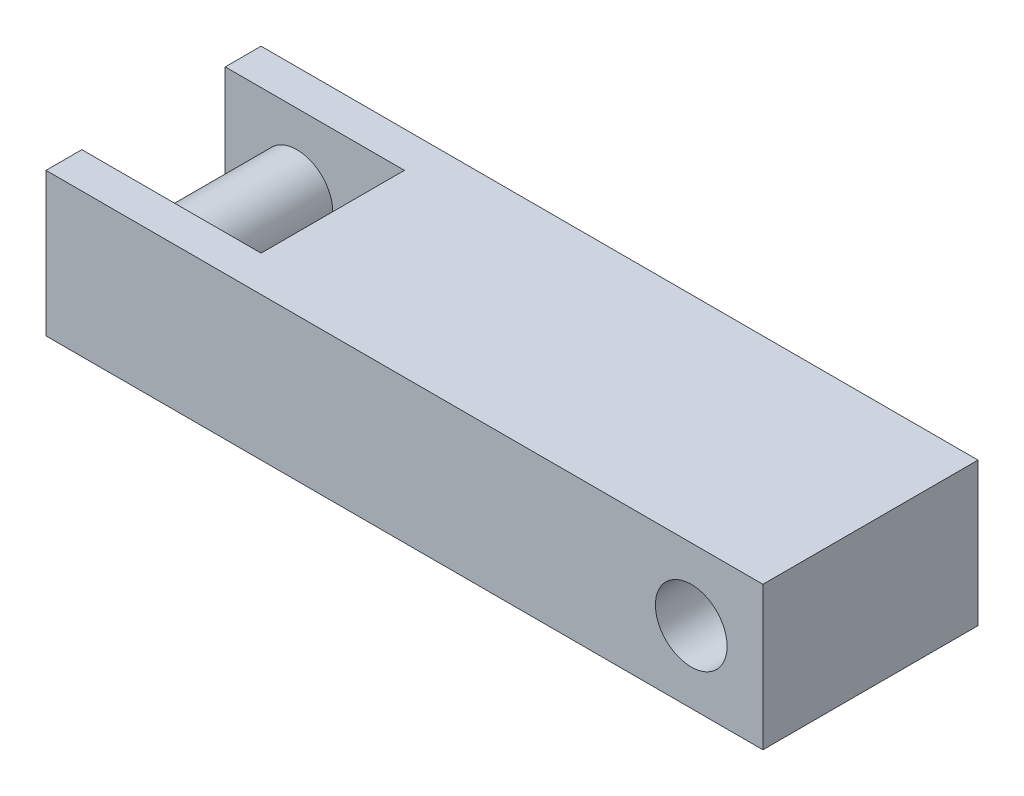
ISO-10303-21;
HEADER;
FILE_DESCRIPTION(('STEP AP214'),'2;1');
FILE_NAME('part.step','',(''),(''),'','','');
FILE_SCHEMA(('AUTOMOTIVE_DESIGN { 1 0 10303 214 1 1 1 1 }'));
ENDSEC;
DATA;
#1=APPLICATION_CONTEXT('core data for automotive mechanical design processes');
#2=APPLICATION_PROTOCOL_DEFINITION('international standard','automotive_design',2000,#1);
#3=PRODUCT_CONTEXT('',#1,'mechanical');
#4=PRODUCT('Part','Part','',(#3));
#5=PRODUCT_RELATED_PRODUCT_CATEGORY('part','',(#4));
#6=PRODUCT_DEFINITION_FORMATION('','',#4);
#7=PRODUCT_DEFINITION_CONTEXT('part definition',#1,'design');
#8=PRODUCT_DEFINITION('design','',#6,#7);
#9=PRODUCT_DEFINITION_SHAPE('','',#8);
#10=(LENGTH_UNIT() NAMED_UNIT(*) SI_UNIT(.MILLI.,.METRE.));
#11=(NAMED_UNIT(*) PLANE_ANGLE_UNIT() SI_UNIT($,.RADIAN.));
#12=(NAMED_UNIT(*) SI_UNIT($,.STERADIAN.) SOLID_ANGLE_UNIT());
#13=UNCERTAINTY_MEASURE_WITH_UNIT(LENGTH_MEASURE(1.E-05),#10,'distance_accuracy_value','');
#14=(GEOMETRIC_REPRESENTATION_CONTEXT(3) GLOBAL_UNCERTAINTY_ASSIGNED_CONTEXT((#13)) GLOBAL_UNIT_ASSIGNED_CONTEXT((#10,
#11,#12)) REPRESENTATION_CONTEXT('',''));
#15=CARTESIAN_POINT('',(0.,0.,0.));
#16=DIRECTION('',(0.,0.,1.));
#17=DIRECTION('',(1.,0.,0.));
#18=AXIS2_PLACEMENT_3D('',#15,#16,#17);
#19=CARTESIAN_POINT('',(0.,0.,30.));
#20=DIRECTION('',(1.,0.,0.));
#21=DIRECTION('',(0.,0.,-1.));
#22=AXIS2_PLACEMENT_3D('',#19,#20,#21);
#23=PLANE('',#22);
#24=DIRECTION('',(0.,0.,-1.));
#25=VECTOR('',#24,1.);
#26=CARTESIAN_POINT('',(0.,0.,30.));
#27=LINE('',#26,#25);
#28=CARTESIAN_POINT('',(0.,0.,5.));
#29=VERTEX_POINT('',#28);
#30=CARTESIAN_POINT('',(0.,0.,0.));
#31=VERTEX_POINT('',#30);
#32=EDGE_CURVE('E46',#29,#31,#27,.T.);
#33=ORIENTED_EDGE('',*,*,#32,.F.);
#34=DIRECTION('',(0.,-1.,0.));
#35=VECTOR('',#34,1.);
#36=CARTESIAN_POINT('',(0.,20.,5.));
#37=LINE('',#36,#35);
#38=CARTESIAN_POINT('',(0.,20.,5.));
#39=VERTEX_POINT('',#38);
#40=EDGE_CURVE('E117',#39,#29,#37,.T.);
#41=ORIENTED_EDGE('',*,*,#40,.F.);
#42=DIRECTION('',(0.,0.,-1.));
#43=VECTOR('',#42,1.);
#44=CARTESIAN_POINT('',(0.,20.,30.));
#45=LINE('',#44,#43);
#46=CARTESIAN_POINT('',(0.,20.,0.));
#47=VERTEX_POINT('',#46);
#48=EDGE_CURVE('E84',#39,#47,#45,.T.);
#49=ORIENTED_EDGE('',*,*,#48,.T.);
#50=DIRECTION('',(0.,-1.,0.));
#51=VECTOR('',#50,1.);
#52=CARTESIAN_POINT('',(0.,0.,0.));
#53=LINE('',#52,#51);
#54=EDGE_CURVE('E149',#47,#31,#53,.T.);
#55=ORIENTED_EDGE('',*,*,#54,.T.);
#56=EDGE_LOOP('',(#33,#41,#49,#55));
#57=FACE_BOUND('',#56,.T.);
#58=ADVANCED_FACE('F37',(#57),#23,.F.);
#59=CARTESIAN_POINT('',(0.,0.,30.));
#60=DIRECTION('',(0.,0.,-1.));
#61=DIRECTION('',(-1.,0.,0.));
#62=AXIS2_PLACEMENT_3D('',#59,#60,#61);
#63=PLANE('',#62);
#64=DIRECTION('',(0.,-1.,0.));
#65=VECTOR('',#64,1.);
#66=CARTESIAN_POINT('',(0.,0.,30.));
#67=LINE('',#66,#65);
#68=CARTESIAN_POINT('',(0.,20.,30.));
#69=VERTEX_POINT('',#68);
#70=CARTESIAN_POINT('',(0.,0.,30.));
#71=VERTEX_POINT('',#70);
#72=EDGE_CURVE('E152',#69,#71,#67,.T.);
#73=ORIENTED_EDGE('',*,*,#72,.T.);
#74=DIRECTION('',(1.,0.,0.));
#75=VECTOR('',#74,1.);
#76=CARTESIAN_POINT('',(0.,0.,30.));
#77=LINE('',#76,#75);
#78=CARTESIAN_POINT('',(100.,0.,30.));
#79=VERTEX_POINT('',#78);
#80=EDGE_CURVE('E91',#71,#79,#77,.T.);
#81=ORIENTED_EDGE('',*,*,#80,.T.);
#82=DIRECTION('',(0.,1.,0.));
#83=VECTOR('',#82,1.);
#84=CARTESIAN_POINT('',(100.,0.,30.));
#85=LINE('',#84,#83);
#86=CARTESIAN_POINT('',(100.,20.,30.));
#87=VERTEX_POINT('',#86);
#88=EDGE_CURVE('E156',#79,#87,#85,.T.);
#89=ORIENTED_EDGE('',*,*,#88,.T.);
#90=DIRECTION('',(-1.,0.,0.));
#91=VECTOR('',#90,1.);
#92=CARTESIAN_POINT('',(0.,20.,30.));
#93=LINE('',#92,#91);
#94=EDGE_CURVE('E62',#87,#69,#93,.T.);
#95=ORIENTED_EDGE('',*,*,#94,.T.);
#96=EDGE_LOOP('',(#73,#81,#89,#95));
#97=FACE_BOUND('',#96,.T.);
#98=CARTESIAN_POINT('',(90.,10.,30.));
#99=DIRECTION('',(0.,0.,1.));
#100=DIRECTION('',(1.,0.,0.));
#101=AXIS2_PLACEMENT_3D('',#98,#99,#100);
#102=CIRCLE('',#101,5.);
#103=CARTESIAN_POINT('',(95.,10.,30.));
#104=VERTEX_POINT('',#103);
#105=EDGE_CURVE('E146',#104,#104,#102,.T.);
#106=ORIENTED_EDGE('',*,*,#105,.F.);
#107=EDGE_LOOP('',(#106));
#108=FACE_BOUND('',#107,.T.);
#109=ADVANCED_FACE('F183',(#97,#108),#63,.F.);
#110=CARTESIAN_POINT('',(0.,0.,0.));
#111=DIRECTION('',(0.,0.,-1.));
#112=DIRECTION('',(-1.,0.,0.));
#113=AXIS2_PLACEMENT_3D('',#110,#111,#112);
#114=PLANE('',#113);
#115=ORIENTED_EDGE('',*,*,#54,.F.);
#116=DIRECTION('',(-1.,0.,0.));
#117=VECTOR('',#116,1.);
#118=CARTESIAN_POINT('',(0.,20.,0.));
#119=LINE('',#118,#117);
#120=CARTESIAN_POINT('',(100.,20.,0.));
#121=VERTEX_POINT('',#120);
#122=EDGE_CURVE('E154',#121,#47,#119,.T.);
#123=ORIENTED_EDGE('',*,*,#122,.F.);
#124=DIRECTION('',(0.,1.,0.));
#125=VECTOR('',#124,1.);
#126=CARTESIAN_POINT('',(100.,0.,0.));
#127=LINE('',#126,#125);
#128=CARTESIAN_POINT('',(100.,0.,0.));
#129=VERTEX_POINT('',#128);
#130=EDGE_CURVE('E162',#129,#121,#127,.T.);
#131=ORIENTED_EDGE('',*,*,#130,.F.);
#132=DIRECTION('',(1.,0.,0.));
#133=VECTOR('',#132,1.);
#134=CARTESIAN_POINT('',(0.,0.,0.));
#135=LINE('',#134,#133);
#136=EDGE_CURVE('E160',#31,#129,#135,.T.);
#137=ORIENTED_EDGE('',*,*,#136,.F.);
#138=EDGE_LOOP('',(#115,#123,#131,#137));
#139=FACE_BOUND('',#138,.T.);
#140=CARTESIAN_POINT('',(90.,10.,0.));
#141=DIRECTION('',(0.,0.,1.));
#142=DIRECTION('',(1.,0.,0.));
#143=AXIS2_PLACEMENT_3D('',#140,#141,#142);
#144=CIRCLE('',#143,5.);
#145=CARTESIAN_POINT('',(95.,10.,0.));
#146=VERTEX_POINT('',#145);
#147=EDGE_CURVE('E141',#146,#146,#144,.T.);
#148=ORIENTED_EDGE('',*,*,#147,.T.);
#149=EDGE_LOOP('',(#148));
#150=FACE_BOUND('',#149,.T.);
#151=ADVANCED_FACE('F179',(#139,#150),#114,.T.);
#152=CARTESIAN_POINT('',(0.,20.,25.));
#153=VERTEX_POINT('',#152);
#154=EDGE_CURVE('E165',#69,#153,#45,.T.);
#155=ORIENTED_EDGE('',*,*,#154,.T.);
#156=DIRECTION('',(0.,1.,0.));
#157=VECTOR('',#156,1.);
#158=CARTESIAN_POINT('',(0.,20.,25.));
#159=LINE('',#158,#157);
#160=CARTESIAN_POINT('',(0.,0.,25.));
#161=VERTEX_POINT('',#160);
#162=EDGE_CURVE('E128',#161,#153,#159,.T.);
#163=ORIENTED_EDGE('',*,*,#162,.F.);
#164=EDGE_CURVE('E11',#71,#161,#27,.T.);
#165=ORIENTED_EDGE('',*,*,#164,.F.);
#166=ORIENTED_EDGE('',*,*,#72,.F.);
#167=EDGE_LOOP('',(#155,#163,#165,#166));
#168=FACE_BOUND('',#167,.T.);
#169=ADVANCED_FACE('F39',(#168),#23,.F.);
#170=CARTESIAN_POINT('',(0.,0.,30.));
#171=DIRECTION('',(0.,1.,0.));
#172=DIRECTION('',(0.,0.,1.));
#173=AXIS2_PLACEMENT_3D('',#170,#171,#172);
#174=PLANE('',#173);
#175=DIRECTION('',(0.,0.,1.));
#176=VECTOR('',#175,1.);
#177=CARTESIAN_POINT('',(25.,0.,5.));
#178=LINE('',#177,#176);
#179=CARTESIAN_POINT('',(25.,0.,5.));
#180=VERTEX_POINT('',#179);
#181=CARTESIAN_POINT('',(25.,0.,25.));
#182=VERTEX_POINT('',#181);
#183=EDGE_CURVE('E124',#180,#182,#178,.T.);
#184=ORIENTED_EDGE('',*,*,#183,.F.);
#185=DIRECTION('',(-1.,0.,0.));
#186=VECTOR('',#185,1.);
#187=CARTESIAN_POINT('',(25.,0.,5.));
#188=LINE('',#187,#186);
#189=EDGE_CURVE('E113',#180,#29,#188,.T.);
#190=ORIENTED_EDGE('',*,*,#189,.T.);
#191=ORIENTED_EDGE('',*,*,#32,.T.);
#192=ORIENTED_EDGE('',*,*,#136,.T.);
#193=DIRECTION('',(0.,0.,-1.));
#194=VECTOR('',#193,1.);
#195=CARTESIAN_POINT('',(100.,0.,30.));
#196=LINE('',#195,#194);
#197=EDGE_CURVE('E171',#79,#129,#196,.T.);
#198=ORIENTED_EDGE('',*,*,#197,.F.);
#199=ORIENTED_EDGE('',*,*,#80,.F.);
#200=ORIENTED_EDGE('',*,*,#164,.T.);
#201=DIRECTION('',(-1.,0.,0.));
#202=VECTOR('',#201,1.);
#203=CARTESIAN_POINT('',(25.,0.,25.));
#204=LINE('',#203,#202);
#205=EDGE_CURVE('E120',#182,#161,#204,.T.);
#206=ORIENTED_EDGE('',*,*,#205,.F.);
#207=EDGE_LOOP('',(#184,#190,#191,#192,#198,#199,#200,#206));
#208=FACE_BOUND('',#207,.T.);
#209=ADVANCED_FACE('F130',(#208),#174,.F.);
#210=CARTESIAN_POINT('',(100.,0.,30.));
#211=DIRECTION('',(-1.,0.,0.));
#212=DIRECTION('',(0.,0.,1.));
#213=AXIS2_PLACEMENT_3D('',#210,#211,#212);
#214=PLANE('',#213);
#215=ORIENTED_EDGE('',*,*,#130,.T.);
#216=DIRECTION('',(0.,0.,-1.));
#217=VECTOR('',#216,1.);
#218=CARTESIAN_POINT('',(100.,20.,30.));
#219=LINE('',#218,#217);
#220=EDGE_CURVE('E168',#87,#121,#219,.T.);
#221=ORIENTED_EDGE('',*,*,#220,.F.);
#222=ORIENTED_EDGE('',*,*,#88,.F.);
#223=ORIENTED_EDGE('',*,*,#197,.T.);
#224=EDGE_LOOP('',(#215,#221,#222,#223));
#225=FACE_BOUND('',#224,.T.);
#226=ADVANCED_FACE('F194',(#225),#214,.F.);
#227=CARTESIAN_POINT('',(0.,20.,30.));
#228=DIRECTION('',(0.,-1.,0.));
#229=DIRECTION('',(0.,0.,-1.));
#230=AXIS2_PLACEMENT_3D('',#227,#228,#229);
#231=PLANE('',#230);
#232=ORIENTED_EDGE('',*,*,#48,.F.);
#233=DIRECTION('',(-1.,0.,0.));
#234=VECTOR('',#233,1.);
#235=CARTESIAN_POINT('',(25.,20.,5.));
#236=LINE('',#235,#234);
#237=CARTESIAN_POINT('',(25.,20.,5.));
#238=VERTEX_POINT('',#237);
#239=EDGE_CURVE('E139',#238,#39,#236,.T.);
#240=ORIENTED_EDGE('',*,*,#239,.F.);
#241=DIRECTION('',(0.,0.,-1.));
#242=VECTOR('',#241,1.);
#243=CARTESIAN_POINT('',(25.,20.,5.));
#244=LINE('',#243,#242);
#245=CARTESIAN_POINT('',(25.,20.,25.));
#246=VERTEX_POINT('',#245);
#247=EDGE_CURVE('E121',#246,#238,#244,.T.);
#248=ORIENTED_EDGE('',*,*,#247,.F.);
#249=DIRECTION('',(-1.,0.,0.));
#250=VECTOR('',#249,1.);
#251=CARTESIAN_POINT('',(25.,20.,25.));
#252=LINE('',#251,#250);
#253=EDGE_CURVE('E142',#246,#153,#252,.T.);
#254=ORIENTED_EDGE('',*,*,#253,.T.);
#255=ORIENTED_EDGE('',*,*,#154,.F.);
#256=ORIENTED_EDGE('',*,*,#94,.F.);
#257=ORIENTED_EDGE('',*,*,#220,.T.);
#258=ORIENTED_EDGE('',*,*,#122,.T.);
#259=EDGE_LOOP('',(#232,#240,#248,#254,#255,#256,#257,#258));
#260=FACE_BOUND('',#259,.T.);
#261=ADVANCED_FACE('F200',(#260),#231,.F.);
#262=CARTESIAN_POINT('',(90.,10.,30.));
#263=DIRECTION('',(0.,0.,-1.));
#264=DIRECTION('',(-1.,0.,0.));
#265=AXIS2_PLACEMENT_3D('',#262,#263,#264);
#266=CYLINDRICAL_SURFACE('',#265,5.);
#267=ORIENTED_EDGE('',*,*,#105,.T.);
#268=EDGE_LOOP('',(#267));
#269=FACE_BOUND('',#268,.T.);
#270=ORIENTED_EDGE('',*,*,#147,.F.);
#271=EDGE_LOOP('',(#270));
#272=FACE_BOUND('',#271,.T.);
#273=ADVANCED_FACE('F212',(#269,#272),#266,.F.);
#274=CARTESIAN_POINT('',(25.,20.,5.));
#275=DIRECTION('',(0.,0.,-1.));
#276=DIRECTION('',(0.,1.,0.));
#277=AXIS2_PLACEMENT_3D('',#274,#275,#276);
#278=PLANE('',#277);
#279=CARTESIAN_POINT('',(10.,9.99999999999999,5.));
#280=DIRECTION('',(0.,0.,-1.));
#281=DIRECTION('',(0.,1.,0.));
#282=AXIS2_PLACEMENT_3D('',#279,#280,#281);
#283=CIRCLE('',#282,5.);
#284=CARTESIAN_POINT('',(10.,15.,5.));
#285=VERTEX_POINT('',#284);
#286=EDGE_CURVE('E137',#285,#285,#283,.T.);
#287=ORIENTED_EDGE('',*,*,#286,.T.);
#288=EDGE_LOOP('',(#287));
#289=FACE_BOUND('',#288,.T.);
#290=ORIENTED_EDGE('',*,*,#40,.T.);
#291=ORIENTED_EDGE('',*,*,#189,.F.);
#292=DIRECTION('',(0.,-1.,0.));
#293=VECTOR('',#292,1.);
#294=CARTESIAN_POINT('',(25.,20.,5.));
#295=LINE('',#294,#293);
#296=EDGE_CURVE('E116',#238,#180,#295,.T.);
#297=ORIENTED_EDGE('',*,*,#296,.F.);
#298=ORIENTED_EDGE('',*,*,#239,.T.);
#299=EDGE_LOOP('',(#290,#291,#297,#298));
#300=FACE_BOUND('',#299,.T.);
#301=ADVANCED_FACE('F115',(#289,#300),#278,.F.);
#302=CARTESIAN_POINT('',(25.,20.,25.));
#303=DIRECTION('',(0.,0.,1.));
#304=DIRECTION('',(0.,-1.,0.));
#305=AXIS2_PLACEMENT_3D('',#302,#303,#304);
#306=PLANE('',#305);
#307=CARTESIAN_POINT('',(10.,9.99999999999999,25.));
#308=DIRECTION('',(0.,0.,1.));
#309=DIRECTION('',(0.,-1.,0.));
#310=AXIS2_PLACEMENT_3D('',#307,#308,#309);
#311=CIRCLE('',#310,5.);
#312=CARTESIAN_POINT('',(10.,4.99999999999999,25.));
#313=VERTEX_POINT('',#312);
#314=EDGE_CURVE('E41',#313,#313,#311,.T.);
#315=ORIENTED_EDGE('',*,*,#314,.T.);
#316=EDGE_LOOP('',(#315));
#317=FACE_BOUND('',#316,.T.);
#318=ORIENTED_EDGE('',*,*,#162,.T.);
#319=ORIENTED_EDGE('',*,*,#253,.F.);
#320=DIRECTION('',(0.,1.,0.));
#321=VECTOR('',#320,1.);
#322=CARTESIAN_POINT('',(25.,20.,25.));
#323=LINE('',#322,#321);
#324=EDGE_CURVE('E53',#182,#246,#323,.T.);
#325=ORIENTED_EDGE('',*,*,#324,.F.);
#326=ORIENTED_EDGE('',*,*,#205,.T.);
#327=EDGE_LOOP('',(#318,#319,#325,#326));
#328=FACE_BOUND('',#327,.T.);
#329=ADVANCED_FACE('F202',(#317,#328),#306,.F.);
#330=CARTESIAN_POINT('',(25.,0.,0.));
#331=DIRECTION('',(-1.,0.,0.));
#332=DIRECTION('',(0.,0.,1.));
#333=AXIS2_PLACEMENT_3D('',#330,#331,#332);
#334=PLANE('',#333);
#335=ORIENTED_EDGE('',*,*,#296,.T.);
#336=ORIENTED_EDGE('',*,*,#183,.T.);
#337=ORIENTED_EDGE('',*,*,#324,.T.);
#338=ORIENTED_EDGE('',*,*,#247,.T.);
#339=EDGE_LOOP('',(#335,#336,#337,#338));
#340=FACE_BOUND('',#339,.T.);
#341=ADVANCED_FACE('F123',(#340),#334,.T.);
#342=CARTESIAN_POINT('',(10.,9.99999999999999,0.));
#343=DIRECTION('',(0.,0.,1.));
#344=DIRECTION('',(1.,0.,0.));
#345=AXIS2_PLACEMENT_3D('',#342,#343,#344);
#346=CYLINDRICAL_SURFACE('',#345,5.);
#347=ORIENTED_EDGE('',*,*,#314,.F.);
#348=EDGE_LOOP('',(#347));
#349=FACE_BOUND('',#348,.T.);
#350=ORIENTED_EDGE('',*,*,#286,.F.);
#351=EDGE_LOOP('',(#350));
#352=FACE_BOUND('',#351,.T.);
#353=ADVANCED_FACE('F210',(#349,#352),#346,.T.);
#354=CLOSED_SHELL('',(#58,#109,#151,#169,#209,#226,#261,#273,#301,#329,#341,#353));
#355=MANIFOLD_SOLID_BREP('B2',#354);
#356=ADVANCED_BREP_SHAPE_REPRESENTATION('',(#18,#355),#14);
#357=SHAPE_DEFINITION_REPRESENTATION(#9,#356);
ENDSEC;
END-ISO-10303-21;
